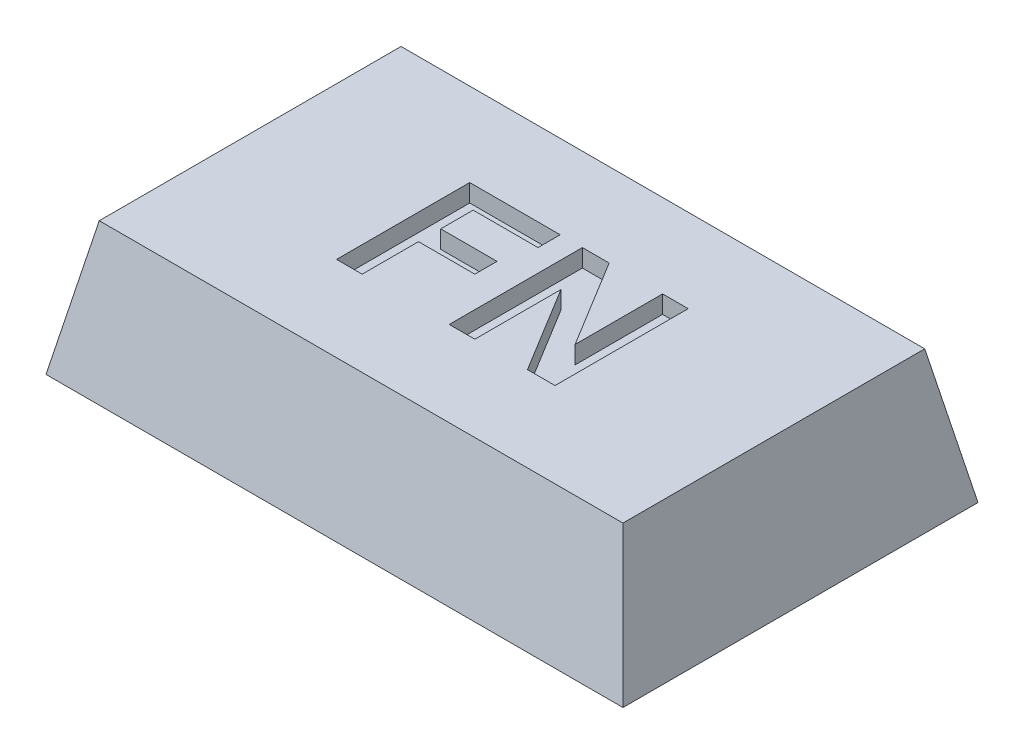
ISO-10303-21;
HEADER;
FILE_DESCRIPTION(('STEP AP214'),'2;1');
FILE_NAME('part.step','',(''),(''),'','','');
FILE_SCHEMA(('AUTOMOTIVE_DESIGN { 1 0 10303 214 1 1 1 1 }'));
ENDSEC;
DATA;
#1=APPLICATION_CONTEXT('core data for automotive mechanical design processes');
#2=APPLICATION_PROTOCOL_DEFINITION('international standard','automotive_design',2000,#1);
#3=PRODUCT_CONTEXT('',#1,'mechanical');
#4=PRODUCT('Part','Part','',(#3));
#5=PRODUCT_RELATED_PRODUCT_CATEGORY('part','',(#4));
#6=PRODUCT_DEFINITION_FORMATION('','',#4);
#7=PRODUCT_DEFINITION_CONTEXT('part definition',#1,'design');
#8=PRODUCT_DEFINITION('design','',#6,#7);
#9=PRODUCT_DEFINITION_SHAPE('','',#8);
#10=(LENGTH_UNIT() NAMED_UNIT(*) SI_UNIT(.MILLI.,.METRE.));
#11=(NAMED_UNIT(*) PLANE_ANGLE_UNIT() SI_UNIT($,.RADIAN.));
#12=(NAMED_UNIT(*) SI_UNIT($,.STERADIAN.) SOLID_ANGLE_UNIT());
#13=UNCERTAINTY_MEASURE_WITH_UNIT(LENGTH_MEASURE(1.E-05),#10,'distance_accuracy_value','');
#14=(GEOMETRIC_REPRESENTATION_CONTEXT(3) GLOBAL_UNCERTAINTY_ASSIGNED_CONTEXT((#13)) GLOBAL_UNIT_ASSIGNED_CONTEXT((#10,
#11,#12)) REPRESENTATION_CONTEXT('',''));
#15=CARTESIAN_POINT('',(0.,0.,0.));
#16=DIRECTION('',(0.,0.,1.));
#17=DIRECTION('',(1.,0.,0.));
#18=AXIS2_PLACEMENT_3D('',#15,#16,#17);
#19=CARTESIAN_POINT('',(0.,3.,0.));
#20=DIRECTION('',(0.,-1.,0.));
#21=DIRECTION('',(0.,0.,-1.));
#22=AXIS2_PLACEMENT_3D('',#19,#20,#21);
#23=PLANE('',#22);
#24=DIRECTION('',(-1.,0.,0.));
#25=VECTOR('',#24,1.);
#26=CARTESIAN_POINT('',(7.14412232211871,3.,-2.5185363973986));
#27=LINE('',#26,#25);
#28=CARTESIAN_POINT('',(7.14412232211871,3.,-2.5185363973986));
#29=VERTEX_POINT('',#28);
#30=CARTESIAN_POINT('',(6.56719924519563,3.,-2.5185363973986));
#31=VERTEX_POINT('',#30);
#32=EDGE_CURVE('E67',#29,#31,#27,.T.);
#33=ORIENTED_EDGE('',*,*,#32,.T.);
#34=DIRECTION('',(0.,0.,-1.));
#35=VECTOR('',#34,1.);
#36=CARTESIAN_POINT('',(6.56719924519563,3.,-2.5185363973986));
#37=LINE('',#36,#35);
#38=CARTESIAN_POINT('',(6.56719924519563,3.,-5.5185363973986));
#39=VERTEX_POINT('',#38);
#40=EDGE_CURVE('E330',#31,#39,#37,.T.);
#41=ORIENTED_EDGE('',*,*,#40,.T.);
#42=DIRECTION('',(1.,0.,0.));
#43=VECTOR('',#42,1.);
#44=CARTESIAN_POINT('',(6.56719924519563,3.,-5.5185363973986));
#45=LINE('',#44,#43);
#46=CARTESIAN_POINT('',(7.16996366827256,3.,-5.5185363973986));
#47=VERTEX_POINT('',#46);
#48=EDGE_CURVE('E326',#39,#47,#45,.T.);
#49=ORIENTED_EDGE('',*,*,#48,.T.);
#50=DIRECTION('',(0.521323795742145,0.,0.853358951434274));
#51=VECTOR('',#50,1.);
#52=CARTESIAN_POINT('',(7.16996366827256,3.,-5.5185363973986));
#53=LINE('',#52,#51);
#54=CARTESIAN_POINT('',(8.37489155288794,3.,-3.54618062816783));
#55=VERTEX_POINT('',#54);
#56=EDGE_CURVE('E322',#47,#55,#53,.T.);
#57=ORIENTED_EDGE('',*,*,#56,.T.);
#58=DIRECTION('',(0.,0.,-1.));
#59=VECTOR('',#58,1.);
#60=CARTESIAN_POINT('',(8.37489155288794,3.,-3.54618062816783));
#61=LINE('',#60,#59);
#62=CARTESIAN_POINT('',(8.37489155288794,3.,-5.5185363973986));
#63=VERTEX_POINT('',#62);
#64=EDGE_CURVE('E318',#55,#63,#61,.T.);
#65=ORIENTED_EDGE('',*,*,#64,.T.);
#66=DIRECTION('',(1.,0.,0.));
#67=VECTOR('',#66,1.);
#68=CARTESIAN_POINT('',(8.37489155288794,3.,-5.5185363973986));
#69=LINE('',#68,#67);
#70=CARTESIAN_POINT('',(8.95181462981102,3.,-5.5185363973986));
#71=VERTEX_POINT('',#70);
#72=EDGE_CURVE('E314',#63,#71,#69,.T.);
#73=ORIENTED_EDGE('',*,*,#72,.T.);
#74=DIRECTION('',(0.,0.,1.));
#75=VECTOR('',#74,1.);
#76=CARTESIAN_POINT('',(8.95181462981102,3.,-5.5185363973986));
#77=LINE('',#76,#75);
#78=CARTESIAN_POINT('',(8.95181462981102,3.,-2.5185363973986));
#79=VERTEX_POINT('',#78);
#80=EDGE_CURVE('E310',#71,#79,#77,.T.);
#81=ORIENTED_EDGE('',*,*,#80,.T.);
#82=DIRECTION('',(-1.,0.,0.));
#83=VECTOR('',#82,1.);
#84=CARTESIAN_POINT('',(8.95181462981102,3.,-2.5185363973986));
#85=LINE('',#84,#83);
#86=CARTESIAN_POINT('',(8.33042039904179,3.,-2.5185363973986));
#87=VERTEX_POINT('',#86);
#88=EDGE_CURVE('E306',#79,#87,#85,.T.);
#89=ORIENTED_EDGE('',*,*,#88,.T.);
#90=DIRECTION('',(-0.521471380338422,0.,-0.853268773299445));
#91=VECTOR('',#90,1.);
#92=CARTESIAN_POINT('',(8.33042039904179,3.,-2.5185363973986));
#93=LINE('',#92,#91);
#94=CARTESIAN_POINT('',(7.14412232211871,3.,-4.45964216662937));
#95=VERTEX_POINT('',#94);
#96=EDGE_CURVE('E301',#87,#95,#93,.T.);
#97=ORIENTED_EDGE('',*,*,#96,.T.);
#98=DIRECTION('',(0.,0.,1.));
#99=VECTOR('',#98,1.);
#100=CARTESIAN_POINT('',(7.14412232211871,3.,-4.45964216662937));
#101=LINE('',#100,#99);
#102=EDGE_CURVE('E297',#95,#29,#101,.T.);
#103=ORIENTED_EDGE('',*,*,#102,.T.);
#104=EDGE_LOOP('',(#33,#41,#49,#57,#65,#73,#81,#89,#97,#103));
#105=FACE_BOUND('',#104,.T.);
#106=DIRECTION('',(-1.,0.,0.));
#107=VECTOR('',#106,1.);
#108=CARTESIAN_POINT('',(13.000055,3.,-0.6));
#109=LINE('',#108,#107);
#110=CARTESIAN_POINT('',(12.4,3.,-0.6));
#111=VERTEX_POINT('',#110);
#112=CARTESIAN_POINT('',(0.6,3.,-0.6));
#113=VERTEX_POINT('',#112);
#114=EDGE_CURVE('E393',#111,#113,#109,.T.);
#115=ORIENTED_EDGE('',*,*,#114,.F.);
#116=DIRECTION('',(0.,0.,1.));
#117=VECTOR('',#116,1.);
#118=CARTESIAN_POINT('',(12.4,3.,-8.));
#119=LINE('',#118,#117);
#120=CARTESIAN_POINT('',(12.4,3.,-7.4));
#121=VERTEX_POINT('',#120);
#122=EDGE_CURVE('E403',#121,#111,#119,.T.);
#123=ORIENTED_EDGE('',*,*,#122,.F.);
#124=DIRECTION('',(-1.,0.,0.));
#125=VECTOR('',#124,1.);
#126=CARTESIAN_POINT('',(13.000055,3.,-7.4));
#127=LINE('',#126,#125);
#128=CARTESIAN_POINT('',(0.599999999999997,3.,-7.4));
#129=VERTEX_POINT('',#128);
#130=EDGE_CURVE('E389',#121,#129,#127,.T.);
#131=ORIENTED_EDGE('',*,*,#130,.T.);
#132=DIRECTION('',(0.,0.,1.));
#133=VECTOR('',#132,1.);
#134=CARTESIAN_POINT('',(0.6,3.,-8.));
#135=LINE('',#134,#133);
#136=EDGE_CURVE('E409',#129,#113,#135,.T.);
#137=ORIENTED_EDGE('',*,*,#136,.T.);
#138=EDGE_LOOP('',(#115,#123,#131,#137));
#139=FACE_BOUND('',#138,.T.);
#140=DIRECTION('',(-1.,0.,0.));
#141=VECTOR('',#140,1.);
#142=CARTESIAN_POINT('',(4.60566078365717,3.,-2.5185363973986));
#143=LINE('',#142,#141);
#144=CARTESIAN_POINT('',(4.60566078365717,3.,-2.5185363973986));
#145=VERTEX_POINT('',#144);
#146=CARTESIAN_POINT('',(4.0287377067341,3.,-2.5185363973986));
#147=VERTEX_POINT('',#146);
#148=EDGE_CURVE('E59',#145,#147,#143,.T.);
#149=ORIENTED_EDGE('',*,*,#148,.T.);
#150=DIRECTION('',(0.,0.,-1.));
#151=VECTOR('',#150,1.);
#152=CARTESIAN_POINT('',(4.0287377067341,3.,-2.5185363973986));
#153=LINE('',#152,#151);
#154=CARTESIAN_POINT('',(4.0287377067341,3.,-5.5185363973986));
#155=VERTEX_POINT('',#154);
#156=EDGE_CURVE('E252',#147,#155,#153,.T.);
#157=ORIENTED_EDGE('',*,*,#156,.T.);
#158=DIRECTION('',(1.,0.,0.));
#159=VECTOR('',#158,1.);
#160=CARTESIAN_POINT('',(4.0287377067341,3.,-5.5185363973986));
#161=LINE('',#160,#159);
#162=CARTESIAN_POINT('',(6.06719924519563,3.,-5.5185363973986));
#163=VERTEX_POINT('',#162);
#164=EDGE_CURVE('E948',#155,#163,#161,.T.);
#165=ORIENTED_EDGE('',*,*,#164,.T.);
#166=DIRECTION('',(0.,0.,1.));
#167=VECTOR('',#166,1.);
#168=CARTESIAN_POINT('',(6.06719924519563,3.,-5.5185363973986));
#169=LINE('',#168,#167);
#170=CARTESIAN_POINT('',(6.06719924519563,3.,-5.0185363973986));
#171=VERTEX_POINT('',#170);
#172=EDGE_CURVE('E950',#163,#171,#169,.T.);
#173=ORIENTED_EDGE('',*,*,#172,.T.);
#174=DIRECTION('',(-1.,0.,0.));
#175=VECTOR('',#174,1.);
#176=CARTESIAN_POINT('',(6.06719924519563,3.,-5.0185363973986));
#177=LINE('',#176,#175);
#178=CARTESIAN_POINT('',(4.60566078365717,3.,-5.0185363973986));
#179=VERTEX_POINT('',#178);
#180=EDGE_CURVE('E955',#171,#179,#177,.T.);
#181=ORIENTED_EDGE('',*,*,#180,.T.);
#182=DIRECTION('',(0.,0.,1.));
#183=VECTOR('',#182,1.);
#184=CARTESIAN_POINT('',(4.60566078365717,3.,-5.0185363973986));
#185=LINE('',#184,#183);
#186=CARTESIAN_POINT('',(4.60566078365717,3.,-4.28776716662937));
#187=VERTEX_POINT('',#186);
#188=EDGE_CURVE('E965',#179,#187,#185,.T.);
#189=ORIENTED_EDGE('',*,*,#188,.T.);
#190=DIRECTION('',(1.,0.,0.));
#191=VECTOR('',#190,1.);
#192=CARTESIAN_POINT('',(4.60566078365717,3.,-4.28776716662937));
#193=LINE('',#192,#191);
#194=CARTESIAN_POINT('',(5.87489155288794,3.,-4.28776716662937));
#195=VERTEX_POINT('',#194);
#196=EDGE_CURVE('E920',#187,#195,#193,.T.);
#197=ORIENTED_EDGE('',*,*,#196,.T.);
#198=DIRECTION('',(0.,0.,1.));
#199=VECTOR('',#198,1.);
#200=CARTESIAN_POINT('',(5.87489155288794,3.,-4.28776716662937));
#201=LINE('',#200,#199);
#202=CARTESIAN_POINT('',(5.87489155288794,3.,-3.78776716662937));
#203=VERTEX_POINT('',#202);
#204=EDGE_CURVE('E915',#195,#203,#201,.T.);
#205=ORIENTED_EDGE('',*,*,#204,.T.);
#206=DIRECTION('',(-1.,0.,0.));
#207=VECTOR('',#206,1.);
#208=CARTESIAN_POINT('',(5.87489155288794,3.,-3.78776716662937));
#209=LINE('',#208,#207);
#210=CARTESIAN_POINT('',(4.60566078365717,3.,-3.78776716662937));
#211=VERTEX_POINT('',#210);
#212=EDGE_CURVE('E909',#203,#211,#209,.T.);
#213=ORIENTED_EDGE('',*,*,#212,.T.);
#214=DIRECTION('',(0.,0.,1.));
#215=VECTOR('',#214,1.);
#216=CARTESIAN_POINT('',(4.60566078365717,3.,-3.78776716662937));
#217=LINE('',#216,#215);
#218=EDGE_CURVE('E248',#211,#145,#217,.T.);
#219=ORIENTED_EDGE('',*,*,#218,.T.);
#220=EDGE_LOOP('',(#149,#157,#165,#173,#181,#189,#197,#205,#213,#219));
#221=FACE_BOUND('',#220,.T.);
#222=ADVANCED_FACE('F43',(#105,#139,#221),#23,.F.);
#223=CARTESIAN_POINT('',(13.,0.,-8.));
#224=DIRECTION('',(-0.98058067569092,-0.196116135138184,0.));
#225=DIRECTION('',(0.196116135138184,-0.98058067569092,0.));
#226=AXIS2_PLACEMENT_3D('',#223,#224,#225);
#227=PLANE('',#226);
#228=DIRECTION('',(-0.192450089729875,0.962250448649376,-0.192450089729875));
#229=VECTOR('',#228,1.);
#230=CARTESIAN_POINT('',(12.7037037037037,1.48148148148148,-0.296296296296295));
#231=LINE('',#230,#229);
#232=CARTESIAN_POINT('',(13.0000245,0.,0.));
#233=VERTEX_POINT('',#232);
#234=EDGE_CURVE('E400',#233,#111,#231,.T.);
#235=ORIENTED_EDGE('',*,*,#234,.F.);
#236=DIRECTION('',(0.,0.,-1.));
#237=VECTOR('',#236,1.);
#238=CARTESIAN_POINT('',(13.,0.,0.));
#239=LINE('',#238,#237);
#240=CARTESIAN_POINT('',(13.0000025,0.,-8.));
#241=VERTEX_POINT('',#240);
#242=EDGE_CURVE('E429',#233,#241,#239,.T.);
#243=ORIENTED_EDGE('',*,*,#242,.T.);
#244=DIRECTION('',(0.192450089729875,-0.962250448649376,-0.192450089729875));
#245=VECTOR('',#244,1.);
#246=CARTESIAN_POINT('',(13.,0.,-8.));
#247=LINE('',#246,#245);
#248=EDGE_CURVE('E396',#121,#241,#247,.T.);
#249=ORIENTED_EDGE('',*,*,#248,.F.);
#250=ORIENTED_EDGE('',*,*,#122,.T.);
#251=EDGE_LOOP('',(#235,#243,#249,#250));
#252=FACE_BOUND('',#251,.T.);
#253=ADVANCED_FACE('F508',(#252),#227,.F.);
#254=CARTESIAN_POINT('',(0.,0.,-8.));
#255=DIRECTION('',(0.98058067569092,-0.196116135138184,0.));
#256=DIRECTION('',(0.196116135138184,0.98058067569092,0.));
#257=AXIS2_PLACEMENT_3D('',#254,#255,#256);
#258=PLANE('',#257);
#259=DIRECTION('',(-0.192450089729875,-0.962250448649376,0.192450089729875));
#260=VECTOR('',#259,1.);
#261=CARTESIAN_POINT('',(0.296296296296296,1.48148148148148,-0.296296296296295));
#262=LINE('',#261,#260);
#263=CARTESIAN_POINT('',(-2.5E-06,0.,0.));
#264=VERTEX_POINT('',#263);
#265=EDGE_CURVE('E435',#113,#264,#262,.T.);
#266=ORIENTED_EDGE('',*,*,#265,.F.);
#267=ORIENTED_EDGE('',*,*,#136,.F.);
#268=DIRECTION('',(0.192450089729875,0.962250448649376,0.192450089729875));
#269=VECTOR('',#268,1.);
#270=CARTESIAN_POINT('',(0.,0.,-8.));
#271=LINE('',#270,#269);
#272=CARTESIAN_POINT('',(0.,0.,-8.));
#273=VERTEX_POINT('',#272);
#274=EDGE_CURVE('E420',#273,#129,#271,.T.);
#275=ORIENTED_EDGE('',*,*,#274,.F.);
#276=DIRECTION('',(0.,0.,1.));
#277=VECTOR('',#276,1.);
#278=CARTESIAN_POINT('',(0.,0.,0.));
#279=LINE('',#278,#277);
#280=EDGE_CURVE('E460',#273,#264,#279,.T.);
#281=ORIENTED_EDGE('',*,*,#280,.T.);
#282=EDGE_LOOP('',(#266,#267,#275,#281));
#283=FACE_BOUND('',#282,.T.);
#284=ADVANCED_FACE('F505',(#283),#258,.F.);
#285=CARTESIAN_POINT('',(0.,0.,0.));
#286=DIRECTION('',(0.,-1.,0.));
#287=DIRECTION('',(0.,0.,-1.));
#288=AXIS2_PLACEMENT_3D('',#285,#286,#287);
#289=PLANE('',#288);
#290=DIRECTION('',(0.,0.,-1.));
#291=VECTOR('',#290,1.);
#292=CARTESIAN_POINT('',(2.500011,0.,-8.));
#293=LINE('',#292,#291);
#294=CARTESIAN_POINT('',(2.500011,0.,-6.9));
#295=VERTEX_POINT('',#294);
#296=CARTESIAN_POINT('',(2.500011,0.,-8.));
#297=VERTEX_POINT('',#296);
#298=EDGE_CURVE('E254',#295,#297,#293,.T.);
#299=ORIENTED_EDGE('',*,*,#298,.F.);
#300=DIRECTION('',(-1.,0.,0.));
#301=VECTOR('',#300,1.);
#302=CARTESIAN_POINT('',(2.500011,0.,-6.9));
#303=LINE('',#302,#301);
#304=CARTESIAN_POINT('',(10.500011,0.,-6.9));
#305=VERTEX_POINT('',#304);
#306=EDGE_CURVE('E370',#305,#295,#303,.T.);
#307=ORIENTED_EDGE('',*,*,#306,.F.);
#308=DIRECTION('',(0.,0.,1.));
#309=VECTOR('',#308,1.);
#310=CARTESIAN_POINT('',(10.500011,0.,-8.));
#311=LINE('',#310,#309);
#312=CARTESIAN_POINT('',(10.500011,0.,-8.));
#313=VERTEX_POINT('',#312);
#314=EDGE_CURVE('E378',#313,#305,#311,.T.);
#315=ORIENTED_EDGE('',*,*,#314,.F.);
#316=DIRECTION('',(-1.,0.,0.));
#317=VECTOR('',#316,1.);
#318=CARTESIAN_POINT('',(0.,0.,-8.));
#319=LINE('',#318,#317);
#320=EDGE_CURVE('E416',#241,#313,#319,.T.);
#321=ORIENTED_EDGE('',*,*,#320,.F.);
#322=ORIENTED_EDGE('',*,*,#242,.F.);
#323=DIRECTION('',(1.,0.,0.));
#324=VECTOR('',#323,1.);
#325=CARTESIAN_POINT('',(0.,0.,0.));
#326=LINE('',#325,#324);
#327=EDGE_CURVE('E476',#264,#233,#326,.T.);
#328=ORIENTED_EDGE('',*,*,#327,.F.);
#329=ORIENTED_EDGE('',*,*,#280,.F.);
#330=EDGE_CURVE('E421',#297,#273,#319,.T.);
#331=ORIENTED_EDGE('',*,*,#330,.F.);
#332=EDGE_LOOP('',(#299,#307,#315,#321,#322,#328,#329,#331));
#333=FACE_BOUND('',#332,.T.);
#334=CARTESIAN_POINT('',(6.50000125,0.,-3.75));
#335=DIRECTION('',(0.,-1.,0.));
#336=DIRECTION('',(0.,0.,-1.));
#337=AXIS2_PLACEMENT_3D('',#334,#335,#336);
#338=CIRCLE('',#337,1.8);
#339=CARTESIAN_POINT('',(6.50000125,0.,-5.55));
#340=VERTEX_POINT('',#339);
#341=EDGE_CURVE('E373',#340,#340,#338,.T.);
#342=ORIENTED_EDGE('',*,*,#341,.F.);
#343=EDGE_LOOP('',(#342));
#344=FACE_BOUND('',#343,.T.);
#345=ADVANCED_FACE('F455',(#333,#344),#289,.T.);
#346=CARTESIAN_POINT('',(13.000055,3.,-7.4));
#347=DIRECTION('',(0.,0.196116135138184,-0.98058067569092));
#348=DIRECTION('',(0.,0.98058067569092,0.196116135138184));
#349=AXIS2_PLACEMENT_3D('',#346,#347,#348);
#350=PLANE('',#349);
#351=ORIENTED_EDGE('',*,*,#248,.T.);
#352=ORIENTED_EDGE('',*,*,#320,.T.);
#353=DIRECTION('',(1.,0.,0.));
#354=VECTOR('',#353,1.);
#355=CARTESIAN_POINT('',(2.500011,0.,-8.));
#356=LINE('',#355,#354);
#357=EDGE_CURVE('E260',#297,#313,#356,.T.);
#358=ORIENTED_EDGE('',*,*,#357,.F.);
#359=ORIENTED_EDGE('',*,*,#330,.T.);
#360=ORIENTED_EDGE('',*,*,#274,.T.);
#361=ORIENTED_EDGE('',*,*,#130,.F.);
#362=EDGE_LOOP('',(#351,#352,#358,#359,#360,#361));
#363=FACE_BOUND('',#362,.T.);
#364=ADVANCED_FACE('F463',(#363),#350,.T.);
#365=CARTESIAN_POINT('',(13.000055,0.,0.));
#366=DIRECTION('',(0.,0.196116135138184,0.98058067569092));
#367=DIRECTION('',(0.,-0.98058067569092,0.196116135138184));
#368=AXIS2_PLACEMENT_3D('',#365,#366,#367);
#369=PLANE('',#368);
#370=ORIENTED_EDGE('',*,*,#234,.T.);
#371=ORIENTED_EDGE('',*,*,#114,.T.);
#372=ORIENTED_EDGE('',*,*,#265,.T.);
#373=ORIENTED_EDGE('',*,*,#327,.T.);
#374=EDGE_LOOP('',(#370,#371,#372,#373));
#375=FACE_BOUND('',#374,.T.);
#376=ADVANCED_FACE('F509',(#375),#369,.T.);
#377=CARTESIAN_POINT('',(6.50000125,0.8,-3.75));
#378=DIRECTION('',(0.,-1.,0.));
#379=DIRECTION('',(0.,0.,-1.));
#380=AXIS2_PLACEMENT_3D('',#377,#378,#379);
#381=CYLINDRICAL_SURFACE('',#380,1.8);
#382=CARTESIAN_POINT('',(6.50000125,0.8,-3.75));
#383=DIRECTION('',(0.,-1.,0.));
#384=DIRECTION('',(0.,0.,-1.));
#385=AXIS2_PLACEMENT_3D('',#382,#383,#384);
#386=CIRCLE('',#385,1.8);
#387=CARTESIAN_POINT('',(6.50000125,0.8,-5.55));
#388=VERTEX_POINT('',#387);
#389=EDGE_CURVE('E385',#388,#388,#386,.T.);
#390=ORIENTED_EDGE('',*,*,#389,.F.);
#391=EDGE_LOOP('',(#390));
#392=FACE_BOUND('',#391,.T.);
#393=ORIENTED_EDGE('',*,*,#341,.T.);
#394=EDGE_LOOP('',(#393));
#395=FACE_BOUND('',#394,.T.);
#396=ADVANCED_FACE('F511',(#392,#395),#381,.F.);
#397=CARTESIAN_POINT('',(6.50000125,0.8,-3.75));
#398=DIRECTION('',(0.,-1.,0.));
#399=DIRECTION('',(0.,0.,-1.));
#400=AXIS2_PLACEMENT_3D('',#397,#398,#399);
#401=PLANE('',#400);
#402=ORIENTED_EDGE('',*,*,#389,.T.);
#403=EDGE_LOOP('',(#402));
#404=FACE_BOUND('',#403,.T.);
#405=ADVANCED_FACE('F517',(#404),#401,.T.);
#406=CARTESIAN_POINT('',(2.500011,-2.,-8.));
#407=DIRECTION('',(0.,0.,1.));
#408=DIRECTION('',(1.,0.,0.));
#409=AXIS2_PLACEMENT_3D('',#406,#407,#408);
#410=PLANE('',#409);
#411=ORIENTED_EDGE('',*,*,#357,.T.);
#412=CARTESIAN_POINT('',(7.03590938486225,2.,-8.));
#413=DIRECTION('',(0.,0.,1.));
#414=DIRECTION('',(1.,0.,0.));
#415=AXIS2_PLACEMENT_3D('',#412,#413,#414);
#416=CIRCLE('',#415,4.);
#417=CARTESIAN_POINT('',(7.03590938486225,-2.,-8.));
#418=VERTEX_POINT('',#417);
#419=EDGE_CURVE('E11',#313,#418,#416,.F.);
#420=ORIENTED_EDGE('',*,*,#419,.T.);
#421=DIRECTION('',(1.,0.,0.));
#422=VECTOR('',#421,1.);
#423=CARTESIAN_POINT('',(2.500011,-2.,-8.));
#424=LINE('',#423,#422);
#425=CARTESIAN_POINT('',(5.96411261513776,-2.,-8.));
#426=VERTEX_POINT('',#425);
#427=EDGE_CURVE('E365',#426,#418,#424,.T.);
#428=ORIENTED_EDGE('',*,*,#427,.F.);
#429=CARTESIAN_POINT('',(5.96411261513776,2.,-8.));
#430=DIRECTION('',(0.,0.,1.));
#431=DIRECTION('',(1.,0.,0.));
#432=AXIS2_PLACEMENT_3D('',#429,#430,#431);
#433=CIRCLE('',#432,4.);
#434=EDGE_CURVE('E52',#426,#297,#433,.F.);
#435=ORIENTED_EDGE('',*,*,#434,.T.);
#436=EDGE_LOOP('',(#411,#420,#428,#435));
#437=FACE_BOUND('',#436,.T.);
#438=ADVANCED_FACE('F448',(#437),#410,.F.);
#439=CARTESIAN_POINT('',(2.500011,-2.,-6.9));
#440=DIRECTION('',(0.,0.,-1.));
#441=DIRECTION('',(-1.,0.,0.));
#442=AXIS2_PLACEMENT_3D('',#439,#440,#441);
#443=PLANE('',#442);
#444=DIRECTION('',(-1.,0.,0.));
#445=VECTOR('',#444,1.);
#446=CARTESIAN_POINT('',(2.500011,-2.,-6.9));
#447=LINE('',#446,#445);
#448=CARTESIAN_POINT('',(7.03590938486225,-2.,-6.9));
#449=VERTEX_POINT('',#448);
#450=CARTESIAN_POINT('',(5.96411261513776,-2.,-6.9));
#451=VERTEX_POINT('',#450);
#452=EDGE_CURVE('E369',#449,#451,#447,.T.);
#453=ORIENTED_EDGE('',*,*,#452,.F.);
#454=CARTESIAN_POINT('',(7.03590938486225,2.,-6.9));
#455=DIRECTION('',(0.,0.,-1.));
#456=DIRECTION('',(-1.,0.,0.));
#457=AXIS2_PLACEMENT_3D('',#454,#455,#456);
#458=CIRCLE('',#457,4.);
#459=EDGE_CURVE('E442',#449,#305,#458,.F.);
#460=ORIENTED_EDGE('',*,*,#459,.T.);
#461=ORIENTED_EDGE('',*,*,#306,.T.);
#462=CARTESIAN_POINT('',(5.96411261513776,2.,-6.9));
#463=DIRECTION('',(0.,0.,-1.));
#464=DIRECTION('',(-1.,0.,0.));
#465=AXIS2_PLACEMENT_3D('',#462,#463,#464);
#466=CIRCLE('',#465,4.);
#467=EDGE_CURVE('E439',#295,#451,#466,.F.);
#468=ORIENTED_EDGE('',*,*,#467,.T.);
#469=EDGE_LOOP('',(#453,#460,#461,#468));
#470=FACE_BOUND('',#469,.T.);
#471=ADVANCED_FACE('F468',(#470),#443,.F.);
#472=CARTESIAN_POINT('',(0.,-2.,0.));
#473=DIRECTION('',(0.,1.,0.));
#474=DIRECTION('',(0.,0.,1.));
#475=AXIS2_PLACEMENT_3D('',#472,#473,#474);
#476=PLANE('',#475);
#477=ORIENTED_EDGE('',*,*,#427,.T.);
#478=DIRECTION('',(0.,0.,1.));
#479=VECTOR('',#478,1.);
#480=CARTESIAN_POINT('',(7.03590938486226,-2.,0.));
#481=LINE('',#480,#479);
#482=EDGE_CURVE('E434',#418,#449,#481,.T.);
#483=ORIENTED_EDGE('',*,*,#482,.T.);
#484=ORIENTED_EDGE('',*,*,#452,.T.);
#485=DIRECTION('',(0.,0.,-1.));
#486=VECTOR('',#485,1.);
#487=CARTESIAN_POINT('',(5.96411261513776,-2.,0.));
#488=LINE('',#487,#486);
#489=EDGE_CURVE('E430',#451,#426,#488,.T.);
#490=ORIENTED_EDGE('',*,*,#489,.T.);
#491=EDGE_LOOP('',(#477,#483,#484,#490));
#492=FACE_BOUND('',#491,.T.);
#493=ADVANCED_FACE('F470',(#492),#476,.F.);
#494=CARTESIAN_POINT('',(7.03590938486225,2.,-7.99999999999999));
#495=DIRECTION('',(0.,0.,1.));
#496=DIRECTION('',(1.,0.,0.));
#497=AXIS2_PLACEMENT_3D('',#494,#495,#496);
#498=CYLINDRICAL_SURFACE('',#497,4.);
#499=ORIENTED_EDGE('',*,*,#419,.F.);
#500=ORIENTED_EDGE('',*,*,#314,.T.);
#501=ORIENTED_EDGE('',*,*,#459,.F.);
#502=ORIENTED_EDGE('',*,*,#482,.F.);
#503=EDGE_LOOP('',(#499,#500,#501,#502));
#504=FACE_BOUND('',#503,.T.);
#505=ADVANCED_FACE('F473',(#504),#498,.T.);
#506=CARTESIAN_POINT('',(5.96411261513776,2.,-8.));
#507=DIRECTION('',(0.,0.,-1.));
#508=DIRECTION('',(-1.,0.,0.));
#509=AXIS2_PLACEMENT_3D('',#506,#507,#508);
#510=CYLINDRICAL_SURFACE('',#509,4.);
#511=ORIENTED_EDGE('',*,*,#467,.F.);
#512=ORIENTED_EDGE('',*,*,#298,.T.);
#513=ORIENTED_EDGE('',*,*,#434,.F.);
#514=ORIENTED_EDGE('',*,*,#489,.F.);
#515=EDGE_LOOP('',(#511,#512,#513,#514));
#516=FACE_BOUND('',#515,.T.);
#517=ADVANCED_FACE('F45',(#516),#510,.T.);
#518=CARTESIAN_POINT('',(7.14412232211871,2.6,-2.5185363973986));
#519=DIRECTION('',(0.,0.,-1.));
#520=DIRECTION('',(-1.,0.,0.));
#521=AXIS2_PLACEMENT_3D('',#518,#519,#520);
#522=PLANE('',#521);
#523=ORIENTED_EDGE('',*,*,#32,.F.);
#524=DIRECTION('',(0.,1.,0.));
#525=VECTOR('',#524,1.);
#526=CARTESIAN_POINT('',(7.14412232211871,2.6,-2.5185363973986));
#527=LINE('',#526,#525);
#528=CARTESIAN_POINT('',(7.14412232211871,2.6,-2.5185363973986));
#529=VERTEX_POINT('',#528);
#530=EDGE_CURVE('E293',#529,#29,#527,.T.);
#531=ORIENTED_EDGE('',*,*,#530,.F.);
#532=DIRECTION('',(-1.,0.,0.));
#533=VECTOR('',#532,1.);
#534=CARTESIAN_POINT('',(7.14412232211871,2.6,-2.5185363973986));
#535=LINE('',#534,#533);
#536=CARTESIAN_POINT('',(6.56719924519563,2.6,-2.5185363973986));
#537=VERTEX_POINT('',#536);
#538=EDGE_CURVE('E302',#529,#537,#535,.T.);
#539=ORIENTED_EDGE('',*,*,#538,.T.);
#540=DIRECTION('',(0.,1.,0.));
#541=VECTOR('',#540,1.);
#542=CARTESIAN_POINT('',(6.56719924519563,2.6,-2.5185363973986));
#543=LINE('',#542,#541);
#544=EDGE_CURVE('E266',#537,#31,#543,.T.);
#545=ORIENTED_EDGE('',*,*,#544,.T.);
#546=EDGE_LOOP('',(#523,#531,#539,#545));
#547=FACE_BOUND('',#546,.T.);
#548=ADVANCED_FACE('F536',(#547),#522,.T.);
#549=CARTESIAN_POINT('',(6.56719924519563,2.6,-2.5185363973986));
#550=DIRECTION('',(1.,0.,0.));
#551=DIRECTION('',(0.,0.,-1.));
#552=AXIS2_PLACEMENT_3D('',#549,#550,#551);
#553=PLANE('',#552);
#554=ORIENTED_EDGE('',*,*,#40,.F.);
#555=ORIENTED_EDGE('',*,*,#544,.F.);
#556=DIRECTION('',(0.,0.,-1.));
#557=VECTOR('',#556,1.);
#558=CARTESIAN_POINT('',(6.56719924519563,2.6,-2.5185363973986));
#559=LINE('',#558,#557);
#560=CARTESIAN_POINT('',(6.56719924519563,2.6,-5.5185363973986));
#561=VERTEX_POINT('',#560);
#562=EDGE_CURVE('E359',#537,#561,#559,.T.);
#563=ORIENTED_EDGE('',*,*,#562,.T.);
#564=DIRECTION('',(0.,1.,0.));
#565=VECTOR('',#564,1.);
#566=CARTESIAN_POINT('',(6.56719924519563,2.6,-5.5185363973986));
#567=LINE('',#566,#565);
#568=EDGE_CURVE('E269',#561,#39,#567,.T.);
#569=ORIENTED_EDGE('',*,*,#568,.T.);
#570=EDGE_LOOP('',(#554,#555,#563,#569));
#571=FACE_BOUND('',#570,.T.);
#572=ADVANCED_FACE('F599',(#571),#553,.T.);
#573=CARTESIAN_POINT('',(6.56719924519563,2.6,-5.5185363973986));
#574=DIRECTION('',(0.,0.,1.));
#575=DIRECTION('',(1.,0.,0.));
#576=AXIS2_PLACEMENT_3D('',#573,#574,#575);
#577=PLANE('',#576);
#578=ORIENTED_EDGE('',*,*,#48,.F.);
#579=ORIENTED_EDGE('',*,*,#568,.F.);
#580=DIRECTION('',(1.,0.,0.));
#581=VECTOR('',#580,1.);
#582=CARTESIAN_POINT('',(6.56719924519563,2.6,-5.5185363973986));
#583=LINE('',#582,#581);
#584=CARTESIAN_POINT('',(7.16996366827256,2.6,-5.5185363973986));
#585=VERTEX_POINT('',#584);
#586=EDGE_CURVE('E356',#561,#585,#583,.T.);
#587=ORIENTED_EDGE('',*,*,#586,.T.);
#588=DIRECTION('',(0.,1.,0.));
#589=VECTOR('',#588,1.);
#590=CARTESIAN_POINT('',(7.16996366827256,2.6,-5.5185363973986));
#591=LINE('',#590,#589);
#592=EDGE_CURVE('E272',#585,#47,#591,.T.);
#593=ORIENTED_EDGE('',*,*,#592,.T.);
#594=EDGE_LOOP('',(#578,#579,#587,#593));
#595=FACE_BOUND('',#594,.T.);
#596=ADVANCED_FACE('F609',(#595),#577,.T.);
#597=CARTESIAN_POINT('',(7.16996366827256,2.6,-5.5185363973986));
#598=DIRECTION('',(-0.853358951434273,0.,0.521323795742145));
#599=DIRECTION('',(0.521323795742145,0.,0.853358951434273));
#600=AXIS2_PLACEMENT_3D('',#597,#598,#599);
#601=PLANE('',#600);
#602=ORIENTED_EDGE('',*,*,#56,.F.);
#603=ORIENTED_EDGE('',*,*,#592,.F.);
#604=DIRECTION('',(0.521323795742145,0.,0.853358951434274));
#605=VECTOR('',#604,1.);
#606=CARTESIAN_POINT('',(7.16996366827256,2.6,-5.5185363973986));
#607=LINE('',#606,#605);
#608=CARTESIAN_POINT('',(8.37489155288794,2.6,-3.54618062816783));
#609=VERTEX_POINT('',#608);
#610=EDGE_CURVE('E353',#585,#609,#607,.T.);
#611=ORIENTED_EDGE('',*,*,#610,.T.);
#612=DIRECTION('',(0.,1.,0.));
#613=VECTOR('',#612,1.);
#614=CARTESIAN_POINT('',(8.37489155288794,2.6,-3.54618062816783));
#615=LINE('',#614,#613);
#616=EDGE_CURVE('E275',#609,#55,#615,.T.);
#617=ORIENTED_EDGE('',*,*,#616,.T.);
#618=EDGE_LOOP('',(#602,#603,#611,#617));
#619=FACE_BOUND('',#618,.T.);
#620=ADVANCED_FACE('F620',(#619),#601,.T.);
#621=CARTESIAN_POINT('',(8.37489155288794,2.6,-3.54618062816783));
#622=DIRECTION('',(1.,0.,0.));
#623=DIRECTION('',(0.,0.,-1.));
#624=AXIS2_PLACEMENT_3D('',#621,#622,#623);
#625=PLANE('',#624);
#626=ORIENTED_EDGE('',*,*,#64,.F.);
#627=ORIENTED_EDGE('',*,*,#616,.F.);
#628=DIRECTION('',(0.,0.,-1.));
#629=VECTOR('',#628,1.);
#630=CARTESIAN_POINT('',(8.37489155288794,2.6,-3.54618062816783));
#631=LINE('',#630,#629);
#632=CARTESIAN_POINT('',(8.37489155288794,2.6,-5.5185363973986));
#633=VERTEX_POINT('',#632);
#634=EDGE_CURVE('E350',#609,#633,#631,.T.);
#635=ORIENTED_EDGE('',*,*,#634,.T.);
#636=DIRECTION('',(0.,1.,0.));
#637=VECTOR('',#636,1.);
#638=CARTESIAN_POINT('',(8.37489155288794,2.6,-5.5185363973986));
#639=LINE('',#638,#637);
#640=EDGE_CURVE('E278',#633,#63,#639,.T.);
#641=ORIENTED_EDGE('',*,*,#640,.T.);
#642=EDGE_LOOP('',(#626,#627,#635,#641));
#643=FACE_BOUND('',#642,.T.);
#644=ADVANCED_FACE('F631',(#643),#625,.T.);
#645=CARTESIAN_POINT('',(8.37489155288794,2.6,-5.5185363973986));
#646=DIRECTION('',(0.,0.,1.));
#647=DIRECTION('',(1.,0.,0.));
#648=AXIS2_PLACEMENT_3D('',#645,#646,#647);
#649=PLANE('',#648);
#650=ORIENTED_EDGE('',*,*,#72,.F.);
#651=ORIENTED_EDGE('',*,*,#640,.F.);
#652=DIRECTION('',(1.,0.,0.));
#653=VECTOR('',#652,1.);
#654=CARTESIAN_POINT('',(8.37489155288794,2.6,-5.5185363973986));
#655=LINE('',#654,#653);
#656=CARTESIAN_POINT('',(8.95181462981102,2.6,-5.5185363973986));
#657=VERTEX_POINT('',#656);
#658=EDGE_CURVE('E347',#633,#657,#655,.T.);
#659=ORIENTED_EDGE('',*,*,#658,.T.);
#660=DIRECTION('',(0.,1.,0.));
#661=VECTOR('',#660,1.);
#662=CARTESIAN_POINT('',(8.95181462981102,2.6,-5.5185363973986));
#663=LINE('',#662,#661);
#664=EDGE_CURVE('E281',#657,#71,#663,.T.);
#665=ORIENTED_EDGE('',*,*,#664,.T.);
#666=EDGE_LOOP('',(#650,#651,#659,#665));
#667=FACE_BOUND('',#666,.T.);
#668=ADVANCED_FACE('F642',(#667),#649,.T.);
#669=CARTESIAN_POINT('',(8.95181462981102,2.6,-5.5185363973986));
#670=DIRECTION('',(-1.,0.,0.));
#671=DIRECTION('',(0.,0.,1.));
#672=AXIS2_PLACEMENT_3D('',#669,#670,#671);
#673=PLANE('',#672);
#674=ORIENTED_EDGE('',*,*,#80,.F.);
#675=ORIENTED_EDGE('',*,*,#664,.F.);
#676=DIRECTION('',(0.,0.,1.));
#677=VECTOR('',#676,1.);
#678=CARTESIAN_POINT('',(8.95181462981102,2.6,-5.5185363973986));
#679=LINE('',#678,#677);
#680=CARTESIAN_POINT('',(8.95181462981102,2.6,-2.5185363973986));
#681=VERTEX_POINT('',#680);
#682=EDGE_CURVE('E344',#657,#681,#679,.T.);
#683=ORIENTED_EDGE('',*,*,#682,.T.);
#684=DIRECTION('',(0.,1.,0.));
#685=VECTOR('',#684,1.);
#686=CARTESIAN_POINT('',(8.95181462981102,2.6,-2.5185363973986));
#687=LINE('',#686,#685);
#688=EDGE_CURVE('E284',#681,#79,#687,.T.);
#689=ORIENTED_EDGE('',*,*,#688,.T.);
#690=EDGE_LOOP('',(#674,#675,#683,#689));
#691=FACE_BOUND('',#690,.T.);
#692=ADVANCED_FACE('F653',(#691),#673,.T.);
#693=CARTESIAN_POINT('',(8.95181462981102,2.6,-2.5185363973986));
#694=DIRECTION('',(0.,0.,-1.));
#695=DIRECTION('',(-1.,0.,0.));
#696=AXIS2_PLACEMENT_3D('',#693,#694,#695);
#697=PLANE('',#696);
#698=ORIENTED_EDGE('',*,*,#88,.F.);
#699=ORIENTED_EDGE('',*,*,#688,.F.);
#700=DIRECTION('',(-1.,0.,0.));
#701=VECTOR('',#700,1.);
#702=CARTESIAN_POINT('',(8.95181462981102,2.6,-2.5185363973986));
#703=LINE('',#702,#701);
#704=CARTESIAN_POINT('',(8.33042039904179,2.6,-2.5185363973986));
#705=VERTEX_POINT('',#704);
#706=EDGE_CURVE('E341',#681,#705,#703,.T.);
#707=ORIENTED_EDGE('',*,*,#706,.T.);
#708=DIRECTION('',(0.,1.,0.));
#709=VECTOR('',#708,1.);
#710=CARTESIAN_POINT('',(8.33042039904179,2.6,-2.5185363973986));
#711=LINE('',#710,#709);
#712=EDGE_CURVE('E287',#705,#87,#711,.T.);
#713=ORIENTED_EDGE('',*,*,#712,.T.);
#714=EDGE_LOOP('',(#698,#699,#707,#713));
#715=FACE_BOUND('',#714,.T.);
#716=ADVANCED_FACE('F664',(#715),#697,.T.);
#717=CARTESIAN_POINT('',(8.33042039904179,2.6,-2.5185363973986));
#718=DIRECTION('',(0.853268773299446,0.,-0.521471380338422));
#719=DIRECTION('',(-0.521471380338422,0.,-0.853268773299446));
#720=AXIS2_PLACEMENT_3D('',#717,#718,#719);
#721=PLANE('',#720);
#722=ORIENTED_EDGE('',*,*,#96,.F.);
#723=ORIENTED_EDGE('',*,*,#712,.F.);
#724=DIRECTION('',(-0.521471380338422,0.,-0.853268773299445));
#725=VECTOR('',#724,1.);
#726=CARTESIAN_POINT('',(8.33042039904179,2.6,-2.5185363973986));
#727=LINE('',#726,#725);
#728=CARTESIAN_POINT('',(7.14412232211871,2.6,-4.45964216662937));
#729=VERTEX_POINT('',#728);
#730=EDGE_CURVE('E338',#705,#729,#727,.T.);
#731=ORIENTED_EDGE('',*,*,#730,.T.);
#732=DIRECTION('',(0.,1.,0.));
#733=VECTOR('',#732,1.);
#734=CARTESIAN_POINT('',(7.14412232211871,2.6,-4.45964216662937));
#735=LINE('',#734,#733);
#736=EDGE_CURVE('E290',#729,#95,#735,.T.);
#737=ORIENTED_EDGE('',*,*,#736,.T.);
#738=EDGE_LOOP('',(#722,#723,#731,#737));
#739=FACE_BOUND('',#738,.T.);
#740=ADVANCED_FACE('F675',(#739),#721,.T.);
#741=CARTESIAN_POINT('',(7.14412232211871,2.6,-4.45964216662937));
#742=DIRECTION('',(-1.,0.,0.));
#743=DIRECTION('',(0.,0.,1.));
#744=AXIS2_PLACEMENT_3D('',#741,#742,#743);
#745=PLANE('',#744);
#746=ORIENTED_EDGE('',*,*,#102,.F.);
#747=ORIENTED_EDGE('',*,*,#736,.F.);
#748=DIRECTION('',(0.,0.,1.));
#749=VECTOR('',#748,1.);
#750=CARTESIAN_POINT('',(7.14412232211871,2.6,-4.45964216662937));
#751=LINE('',#750,#749);
#752=EDGE_CURVE('E296',#729,#529,#751,.T.);
#753=ORIENTED_EDGE('',*,*,#752,.T.);
#754=ORIENTED_EDGE('',*,*,#530,.T.);
#755=EDGE_LOOP('',(#746,#747,#753,#754));
#756=FACE_BOUND('',#755,.T.);
#757=ADVANCED_FACE('F686',(#756),#745,.T.);
#758=CARTESIAN_POINT('',(0.,2.6,0.));
#759=DIRECTION('',(0.,-1.,0.));
#760=DIRECTION('',(0.,0.,-1.));
#761=AXIS2_PLACEMENT_3D('',#758,#759,#760);
#762=PLANE('',#761);
#763=ORIENTED_EDGE('',*,*,#538,.F.);
#764=ORIENTED_EDGE('',*,*,#752,.F.);
#765=ORIENTED_EDGE('',*,*,#730,.F.);
#766=ORIENTED_EDGE('',*,*,#706,.F.);
#767=ORIENTED_EDGE('',*,*,#682,.F.);
#768=ORIENTED_EDGE('',*,*,#658,.F.);
#769=ORIENTED_EDGE('',*,*,#634,.F.);
#770=ORIENTED_EDGE('',*,*,#610,.F.);
#771=ORIENTED_EDGE('',*,*,#586,.F.);
#772=ORIENTED_EDGE('',*,*,#562,.F.);
#773=EDGE_LOOP('',(#763,#764,#765,#766,#767,#768,#769,#770,#771,#772));
#774=FACE_BOUND('',#773,.T.);
#775=ADVANCED_FACE('F543',(#774),#762,.F.);
#776=CARTESIAN_POINT('',(4.60566078365717,2.6,-2.5185363973986));
#777=DIRECTION('',(0.,0.,-1.));
#778=DIRECTION('',(-1.,0.,0.));
#779=AXIS2_PLACEMENT_3D('',#776,#777,#778);
#780=PLANE('',#779);
#781=ORIENTED_EDGE('',*,*,#148,.F.);
#782=DIRECTION('',(0.,1.,0.));
#783=VECTOR('',#782,1.);
#784=CARTESIAN_POINT('',(4.60566078365717,2.6,-2.5185363973986));
#785=LINE('',#784,#783);
#786=CARTESIAN_POINT('',(4.60566078365717,2.6,-2.5185363973986));
#787=VERTEX_POINT('',#786);
#788=EDGE_CURVE('E246',#787,#145,#785,.T.);
#789=ORIENTED_EDGE('',*,*,#788,.F.);
#790=DIRECTION('',(-1.,0.,0.));
#791=VECTOR('',#790,1.);
#792=CARTESIAN_POINT('',(4.60566078365717,2.6,-2.5185363973986));
#793=LINE('',#792,#791);
#794=CARTESIAN_POINT('',(4.0287377067341,2.6,-2.5185363973986));
#795=VERTEX_POINT('',#794);
#796=EDGE_CURVE('E236',#787,#795,#793,.T.);
#797=ORIENTED_EDGE('',*,*,#796,.T.);
#798=DIRECTION('',(0.,1.,0.));
#799=VECTOR('',#798,1.);
#800=CARTESIAN_POINT('',(4.0287377067341,2.6,-2.5185363973986));
#801=LINE('',#800,#799);
#802=EDGE_CURVE('E245',#795,#147,#801,.T.);
#803=ORIENTED_EDGE('',*,*,#802,.T.);
#804=EDGE_LOOP('',(#781,#789,#797,#803));
#805=FACE_BOUND('',#804,.T.);
#806=ADVANCED_FACE('F244',(#805),#780,.T.);
#807=CARTESIAN_POINT('',(4.0287377067341,2.6,-2.5185363973986));
#808=DIRECTION('',(1.,0.,0.));
#809=DIRECTION('',(0.,0.,-1.));
#810=AXIS2_PLACEMENT_3D('',#807,#808,#809);
#811=PLANE('',#810);
#812=ORIENTED_EDGE('',*,*,#156,.F.);
#813=ORIENTED_EDGE('',*,*,#802,.F.);
#814=DIRECTION('',(0.,0.,-1.));
#815=VECTOR('',#814,1.);
#816=CARTESIAN_POINT('',(4.0287377067341,2.6,-2.5185363973986));
#817=LINE('',#816,#815);
#818=CARTESIAN_POINT('',(4.0287377067341,2.6,-5.5185363973986));
#819=VERTEX_POINT('',#818);
#820=EDGE_CURVE('E232',#795,#819,#817,.T.);
#821=ORIENTED_EDGE('',*,*,#820,.T.);
#822=DIRECTION('',(0.,1.,0.));
#823=VECTOR('',#822,1.);
#824=CARTESIAN_POINT('',(4.0287377067341,2.6,-5.5185363973986));
#825=LINE('',#824,#823);
#826=EDGE_CURVE('E255',#819,#155,#825,.T.);
#827=ORIENTED_EDGE('',*,*,#826,.T.);
#828=EDGE_LOOP('',(#812,#813,#821,#827));
#829=FACE_BOUND('',#828,.T.);
#830=ADVANCED_FACE('F250',(#829),#811,.T.);
#831=CARTESIAN_POINT('',(4.0287377067341,2.6,-5.5185363973986));
#832=DIRECTION('',(0.,0.,1.));
#833=DIRECTION('',(1.,0.,0.));
#834=AXIS2_PLACEMENT_3D('',#831,#832,#833);
#835=PLANE('',#834);
#836=ORIENTED_EDGE('',*,*,#164,.F.);
#837=ORIENTED_EDGE('',*,*,#826,.F.);
#838=DIRECTION('',(1.,0.,0.));
#839=VECTOR('',#838,1.);
#840=CARTESIAN_POINT('',(4.0287377067341,2.6,-5.5185363973986));
#841=LINE('',#840,#839);
#842=CARTESIAN_POINT('',(6.06719924519563,2.6,-5.5185363973986));
#843=VERTEX_POINT('',#842);
#844=EDGE_CURVE('E238',#819,#843,#841,.T.);
#845=ORIENTED_EDGE('',*,*,#844,.T.);
#846=DIRECTION('',(0.,1.,0.));
#847=VECTOR('',#846,1.);
#848=CARTESIAN_POINT('',(6.06719924519563,2.6,-5.5185363973986));
#849=LINE('',#848,#847);
#850=EDGE_CURVE('E262',#843,#163,#849,.T.);
#851=ORIENTED_EDGE('',*,*,#850,.T.);
#852=EDGE_LOOP('',(#836,#837,#845,#851));
#853=FACE_BOUND('',#852,.T.);
#854=ADVANCED_FACE('F724',(#853),#835,.T.);
#855=CARTESIAN_POINT('',(6.06719924519563,2.6,-5.5185363973986));
#856=DIRECTION('',(-1.,0.,0.));
#857=DIRECTION('',(0.,0.,1.));
#858=AXIS2_PLACEMENT_3D('',#855,#856,#857);
#859=PLANE('',#858);
#860=ORIENTED_EDGE('',*,*,#172,.F.);
#861=ORIENTED_EDGE('',*,*,#850,.F.);
#862=DIRECTION('',(0.,0.,1.));
#863=VECTOR('',#862,1.);
#864=CARTESIAN_POINT('',(6.06719924519563,2.6,-5.5185363973986));
#865=LINE('',#864,#863);
#866=CARTESIAN_POINT('',(6.06719924519563,2.6,-5.0185363973986));
#867=VERTEX_POINT('',#866);
#868=EDGE_CURVE('E995',#843,#867,#865,.T.);
#869=ORIENTED_EDGE('',*,*,#868,.T.);
#870=DIRECTION('',(0.,1.,0.));
#871=VECTOR('',#870,1.);
#872=CARTESIAN_POINT('',(6.06719924519563,2.6,-5.0185363973986));
#873=LINE('',#872,#871);
#874=EDGE_CURVE('E941',#867,#171,#873,.T.);
#875=ORIENTED_EDGE('',*,*,#874,.T.);
#876=EDGE_LOOP('',(#860,#861,#869,#875));
#877=FACE_BOUND('',#876,.T.);
#878=ADVANCED_FACE('F734',(#877),#859,.T.);
#879=CARTESIAN_POINT('',(6.06719924519563,2.6,-5.0185363973986));
#880=DIRECTION('',(0.,0.,-1.));
#881=DIRECTION('',(-1.,0.,0.));
#882=AXIS2_PLACEMENT_3D('',#879,#880,#881);
#883=PLANE('',#882);
#884=ORIENTED_EDGE('',*,*,#180,.F.);
#885=ORIENTED_EDGE('',*,*,#874,.F.);
#886=DIRECTION('',(-1.,0.,0.));
#887=VECTOR('',#886,1.);
#888=CARTESIAN_POINT('',(6.06719924519563,2.6,-5.0185363973986));
#889=LINE('',#888,#887);
#890=CARTESIAN_POINT('',(4.60566078365717,2.6,-5.0185363973986));
#891=VERTEX_POINT('',#890);
#892=EDGE_CURVE('E992',#867,#891,#889,.T.);
#893=ORIENTED_EDGE('',*,*,#892,.T.);
#894=DIRECTION('',(0.,1.,0.));
#895=VECTOR('',#894,1.);
#896=CARTESIAN_POINT('',(4.60566078365717,2.6,-5.0185363973986));
#897=LINE('',#896,#895);
#898=EDGE_CURVE('E938',#891,#179,#897,.T.);
#899=ORIENTED_EDGE('',*,*,#898,.T.);
#900=EDGE_LOOP('',(#884,#885,#893,#899));
#901=FACE_BOUND('',#900,.T.);
#902=ADVANCED_FACE('F745',(#901),#883,.T.);
#903=CARTESIAN_POINT('',(4.60566078365717,2.6,-5.0185363973986));
#904=DIRECTION('',(-1.,0.,0.));
#905=DIRECTION('',(0.,0.,1.));
#906=AXIS2_PLACEMENT_3D('',#903,#904,#905);
#907=PLANE('',#906);
#908=ORIENTED_EDGE('',*,*,#188,.F.);
#909=ORIENTED_EDGE('',*,*,#898,.F.);
#910=DIRECTION('',(0.,0.,1.));
#911=VECTOR('',#910,1.);
#912=CARTESIAN_POINT('',(4.60566078365717,2.6,-5.0185363973986));
#913=LINE('',#912,#911);
#914=CARTESIAN_POINT('',(4.60566078365717,2.6,-4.28776716662937));
#915=VERTEX_POINT('',#914);
#916=EDGE_CURVE('E989',#891,#915,#913,.T.);
#917=ORIENTED_EDGE('',*,*,#916,.T.);
#918=DIRECTION('',(0.,1.,0.));
#919=VECTOR('',#918,1.);
#920=CARTESIAN_POINT('',(4.60566078365717,2.6,-4.28776716662937));
#921=LINE('',#920,#919);
#922=EDGE_CURVE('E935',#915,#187,#921,.T.);
#923=ORIENTED_EDGE('',*,*,#922,.T.);
#924=EDGE_LOOP('',(#908,#909,#917,#923));
#925=FACE_BOUND('',#924,.T.);
#926=ADVANCED_FACE('F756',(#925),#907,.T.);
#927=CARTESIAN_POINT('',(4.60566078365717,2.6,-4.28776716662937));
#928=DIRECTION('',(0.,0.,1.));
#929=DIRECTION('',(1.,0.,0.));
#930=AXIS2_PLACEMENT_3D('',#927,#928,#929);
#931=PLANE('',#930);
#932=ORIENTED_EDGE('',*,*,#196,.F.);
#933=ORIENTED_EDGE('',*,*,#922,.F.);
#934=DIRECTION('',(1.,0.,0.));
#935=VECTOR('',#934,1.);
#936=CARTESIAN_POINT('',(4.60566078365717,2.6,-4.28776716662937));
#937=LINE('',#936,#935);
#938=CARTESIAN_POINT('',(5.87489155288794,2.6,-4.28776716662937));
#939=VERTEX_POINT('',#938);
#940=EDGE_CURVE('E974',#915,#939,#937,.T.);
#941=ORIENTED_EDGE('',*,*,#940,.T.);
#942=DIRECTION('',(0.,1.,0.));
#943=VECTOR('',#942,1.);
#944=CARTESIAN_POINT('',(5.87489155288794,2.6,-4.28776716662937));
#945=LINE('',#944,#943);
#946=EDGE_CURVE('E932',#939,#195,#945,.T.);
#947=ORIENTED_EDGE('',*,*,#946,.T.);
#948=EDGE_LOOP('',(#932,#933,#941,#947));
#949=FACE_BOUND('',#948,.T.);
#950=ADVANCED_FACE('F767',(#949),#931,.T.);
#951=CARTESIAN_POINT('',(5.87489155288794,2.6,-4.28776716662937));
#952=DIRECTION('',(-1.,0.,0.));
#953=DIRECTION('',(0.,0.,1.));
#954=AXIS2_PLACEMENT_3D('',#951,#952,#953);
#955=PLANE('',#954);
#956=ORIENTED_EDGE('',*,*,#204,.F.);
#957=ORIENTED_EDGE('',*,*,#946,.F.);
#958=DIRECTION('',(0.,0.,1.));
#959=VECTOR('',#958,1.);
#960=CARTESIAN_POINT('',(5.87489155288794,2.6,-4.28776716662937));
#961=LINE('',#960,#959);
#962=CARTESIAN_POINT('',(5.87489155288794,2.6,-3.78776716662937));
#963=VERTEX_POINT('',#962);
#964=EDGE_CURVE('E976',#939,#963,#961,.T.);
#965=ORIENTED_EDGE('',*,*,#964,.T.);
#966=DIRECTION('',(0.,1.,0.));
#967=VECTOR('',#966,1.);
#968=CARTESIAN_POINT('',(5.87489155288794,2.6,-3.78776716662937));
#969=LINE('',#968,#967);
#970=EDGE_CURVE('E929',#963,#203,#969,.T.);
#971=ORIENTED_EDGE('',*,*,#970,.T.);
#972=EDGE_LOOP('',(#956,#957,#965,#971));
#973=FACE_BOUND('',#972,.T.);
#974=ADVANCED_FACE('F778',(#973),#955,.T.);
#975=CARTESIAN_POINT('',(5.87489155288794,2.6,-3.78776716662937));
#976=DIRECTION('',(0.,0.,-1.));
#977=DIRECTION('',(-1.,0.,0.));
#978=AXIS2_PLACEMENT_3D('',#975,#976,#977);
#979=PLANE('',#978);
#980=ORIENTED_EDGE('',*,*,#212,.F.);
#981=ORIENTED_EDGE('',*,*,#970,.F.);
#982=DIRECTION('',(-1.,0.,0.));
#983=VECTOR('',#982,1.);
#984=CARTESIAN_POINT('',(5.87489155288794,2.6,-3.78776716662937));
#985=LINE('',#984,#983);
#986=CARTESIAN_POINT('',(4.60566078365717,2.6,-3.78776716662937));
#987=VERTEX_POINT('',#986);
#988=EDGE_CURVE('E978',#963,#987,#985,.T.);
#989=ORIENTED_EDGE('',*,*,#988,.T.);
#990=DIRECTION('',(0.,1.,0.));
#991=VECTOR('',#990,1.);
#992=CARTESIAN_POINT('',(4.60566078365717,2.6,-3.78776716662937));
#993=LINE('',#992,#991);
#994=EDGE_CURVE('E907',#987,#211,#993,.T.);
#995=ORIENTED_EDGE('',*,*,#994,.T.);
#996=EDGE_LOOP('',(#980,#981,#989,#995));
#997=FACE_BOUND('',#996,.T.);
#998=ADVANCED_FACE('F789',(#997),#979,.T.);
#999=CARTESIAN_POINT('',(4.60566078365717,2.6,-3.78776716662937));
#1000=DIRECTION('',(-1.,0.,0.));
#1001=DIRECTION('',(0.,0.,1.));
#1002=AXIS2_PLACEMENT_3D('',#999,#1000,#1001);
#1003=PLANE('',#1002);
#1004=ORIENTED_EDGE('',*,*,#218,.F.);
#1005=ORIENTED_EDGE('',*,*,#994,.F.);
#1006=DIRECTION('',(0.,0.,1.));
#1007=VECTOR('',#1006,1.);
#1008=CARTESIAN_POINT('',(4.60566078365717,2.6,-3.78776716662937));
#1009=LINE('',#1008,#1007);
#1010=EDGE_CURVE('E926',#987,#787,#1009,.T.);
#1011=ORIENTED_EDGE('',*,*,#1010,.T.);
#1012=ORIENTED_EDGE('',*,*,#788,.T.);
#1013=EDGE_LOOP('',(#1004,#1005,#1011,#1012));
#1014=FACE_BOUND('',#1013,.T.);
#1015=ADVANCED_FACE('F800',(#1014),#1003,.T.);
#1016=CARTESIAN_POINT('',(0.,2.6,0.));
#1017=DIRECTION('',(0.,-1.,0.));
#1018=DIRECTION('',(0.,0.,-1.));
#1019=AXIS2_PLACEMENT_3D('',#1016,#1017,#1018);
#1020=PLANE('',#1019);
#1021=ORIENTED_EDGE('',*,*,#796,.F.);
#1022=ORIENTED_EDGE('',*,*,#1010,.F.);
#1023=ORIENTED_EDGE('',*,*,#988,.F.);
#1024=ORIENTED_EDGE('',*,*,#964,.F.);
#1025=ORIENTED_EDGE('',*,*,#940,.F.);
#1026=ORIENTED_EDGE('',*,*,#916,.F.);
#1027=ORIENTED_EDGE('',*,*,#892,.F.);
#1028=ORIENTED_EDGE('',*,*,#868,.F.);
#1029=ORIENTED_EDGE('',*,*,#844,.F.);
#1030=ORIENTED_EDGE('',*,*,#820,.F.);
#1031=EDGE_LOOP('',(#1021,#1022,#1023,#1024,#1025,#1026,#1027,#1028,#1029,#1030));
#1032=FACE_BOUND('',#1031,.T.);
#1033=ADVANCED_FACE('F234',(#1032),#1020,.F.);
#1034=CLOSED_SHELL('',(#222,#253,#284,#345,#364,#376,#396,#405,#438,#471,#493,#505,#517,#548,
#572,#596,#620,#644,#668,#692,#716,#740,#757,#775,#806,#830,#854,#878,#902,#926,#950,#974,#998,
#1015,#1033));
#1035=MANIFOLD_SOLID_BREP('B2',#1034);
#1036=ADVANCED_BREP_SHAPE_REPRESENTATION('',(#18,#1035),#14);
#1037=SHAPE_DEFINITION_REPRESENTATION(#9,#1036);
ENDSEC;
END-ISO-10303-21;
